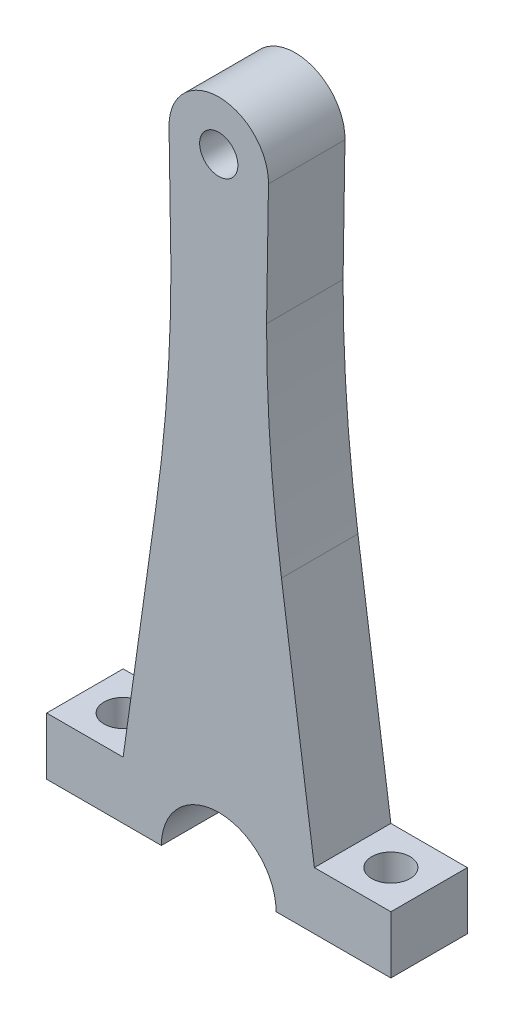
ISO-10303-21;
HEADER;
FILE_DESCRIPTION(('STEP AP214'),'2;1');
FILE_NAME('part.step','',(''),(''),'','','');
FILE_SCHEMA(('AUTOMOTIVE_DESIGN { 1 0 10303 214 1 1 1 1 }'));
ENDSEC;
DATA;
#1=APPLICATION_CONTEXT('core data for automotive mechanical design processes');
#2=APPLICATION_PROTOCOL_DEFINITION('international standard','automotive_design',2000,#1);
#3=PRODUCT_CONTEXT('',#1,'mechanical');
#4=PRODUCT('Part','Part','',(#3));
#5=PRODUCT_RELATED_PRODUCT_CATEGORY('part','',(#4));
#6=PRODUCT_DEFINITION_FORMATION('','',#4);
#7=PRODUCT_DEFINITION_CONTEXT('part definition',#1,'design');
#8=PRODUCT_DEFINITION('design','',#6,#7);
#9=PRODUCT_DEFINITION_SHAPE('','',#8);
#10=(LENGTH_UNIT() NAMED_UNIT(*) SI_UNIT(.MILLI.,.METRE.));
#11=(NAMED_UNIT(*) PLANE_ANGLE_UNIT() SI_UNIT($,.RADIAN.));
#12=(NAMED_UNIT(*) SI_UNIT($,.STERADIAN.) SOLID_ANGLE_UNIT());
#13=UNCERTAINTY_MEASURE_WITH_UNIT(LENGTH_MEASURE(1.E-05),#10,'distance_accuracy_value','');
#14=(GEOMETRIC_REPRESENTATION_CONTEXT(3) GLOBAL_UNCERTAINTY_ASSIGNED_CONTEXT((#13)) GLOBAL_UNIT_ASSIGNED_CONTEXT((#10,
#11,#12)) REPRESENTATION_CONTEXT('',''));
#15=CARTESIAN_POINT('',(0.,0.,0.));
#16=DIRECTION('',(0.,0.,1.));
#17=DIRECTION('',(1.,0.,0.));
#18=AXIS2_PLACEMENT_3D('',#15,#16,#17);
#19=CARTESIAN_POINT('',(10.4353807187644,-0.163126477774048,20.));
#20=DIRECTION('',(-0.999877841767252,0.0156301485233326,0.));
#21=DIRECTION('',(-0.0156301485233326,-0.999877841767252,0.));
#22=AXIS2_PLACEMENT_3D('',#19,#20,#21);
#23=PLANE('',#22);
#24=DIRECTION('',(0.0156301485233326,0.999877841767252,0.));
#25=VECTOR('',#24,1.);
#26=CARTESIAN_POINT('',(10.4353807187644,-0.163126477774048,0.));
#27=LINE('',#26,#25);
#28=CARTESIAN_POINT('',(12.5,131.912846307208,0.));
#29=VERTEX_POINT('',#28);
#30=CARTESIAN_POINT('',(12.9984119429743,163.796808069197,0.));
#31=VERTEX_POINT('',#30);
#32=EDGE_CURVE('E188',#29,#31,#27,.T.);
#33=ORIENTED_EDGE('',*,*,#32,.T.);
#34=DIRECTION('',(0.,0.,-1.));
#35=VECTOR('',#34,1.);
#36=CARTESIAN_POINT('',(12.9984119429743,163.796808069197,20.));
#37=LINE('',#36,#35);
#38=CARTESIAN_POINT('',(12.9984119429743,163.796808069197,20.));
#39=VERTEX_POINT('',#38);
#40=EDGE_CURVE('E11',#39,#31,#37,.T.);
#41=ORIENTED_EDGE('',*,*,#40,.F.);
#42=DIRECTION('',(0.0156301485233326,0.999877841767252,0.));
#43=VECTOR('',#42,1.);
#44=CARTESIAN_POINT('',(10.4353807187644,-0.163126477774048,20.));
#45=LINE('',#44,#43);
#46=CARTESIAN_POINT('',(12.5,131.912846307208,20.));
#47=VERTEX_POINT('',#46);
#48=EDGE_CURVE('E297',#47,#39,#45,.T.);
#49=ORIENTED_EDGE('',*,*,#48,.F.);
#50=DIRECTION('',(0.,0.,-1.));
#51=VECTOR('',#50,1.);
#52=CARTESIAN_POINT('',(12.5,131.912846307208,20.));
#53=LINE('',#52,#51);
#54=EDGE_CURVE('E180',#47,#29,#53,.T.);
#55=ORIENTED_EDGE('',*,*,#54,.T.);
#56=EDGE_LOOP('',(#33,#41,#49,#55));
#57=FACE_BOUND('',#56,.T.);
#58=ADVANCED_FACE('F47',(#57),#23,.F.);
#59=CARTESIAN_POINT('',(0.,164.,20.));
#60=DIRECTION('',(0.,0.,-1.));
#61=DIRECTION('',(-1.,0.,0.));
#62=AXIS2_PLACEMENT_3D('',#59,#60,#61);
#63=CYLINDRICAL_SURFACE('',#62,13.);
#64=CARTESIAN_POINT('',(0.,164.,0.));
#65=DIRECTION('',(0.,0.,1.));
#66=DIRECTION('',(1.,0.,0.));
#67=AXIS2_PLACEMENT_3D('',#64,#65,#66);
#68=CIRCLE('',#67,13.);
#69=CARTESIAN_POINT('',(-12.9984119429743,163.796808069197,0.));
#70=VERTEX_POINT('',#69);
#71=EDGE_CURVE('E193',#31,#70,#68,.T.);
#72=ORIENTED_EDGE('',*,*,#71,.T.);
#73=DIRECTION('',(0.,0.,-1.));
#74=VECTOR('',#73,1.);
#75=CARTESIAN_POINT('',(-12.9984119429743,163.796808069197,20.));
#76=LINE('',#75,#74);
#77=CARTESIAN_POINT('',(-12.9984119429743,163.796808069197,20.));
#78=VERTEX_POINT('',#77);
#79=EDGE_CURVE('E57',#78,#70,#76,.T.);
#80=ORIENTED_EDGE('',*,*,#79,.F.);
#81=CARTESIAN_POINT('',(0.,164.,20.));
#82=DIRECTION('',(0.,0.,1.));
#83=DIRECTION('',(1.,0.,0.));
#84=AXIS2_PLACEMENT_3D('',#81,#82,#83);
#85=CIRCLE('',#84,13.);
#86=EDGE_CURVE('E122',#39,#78,#85,.T.);
#87=ORIENTED_EDGE('',*,*,#86,.F.);
#88=ORIENTED_EDGE('',*,*,#40,.T.);
#89=EDGE_LOOP('',(#72,#80,#87,#88));
#90=FACE_BOUND('',#89,.T.);
#91=ADVANCED_FACE('F277',(#90),#63,.T.);
#92=CARTESIAN_POINT('',(-10.4353807187643,-0.163126477774052,20.));
#93=DIRECTION('',(-0.999877841767252,-0.015630148523333,0.));
#94=DIRECTION('',(0.015630148523333,-0.999877841767252,0.));
#95=AXIS2_PLACEMENT_3D('',#92,#93,#94);
#96=PLANE('',#95);
#97=DIRECTION('',(-0.015630148523333,0.999877841767252,0.));
#98=VECTOR('',#97,1.);
#99=CARTESIAN_POINT('',(-10.4353807187643,-0.163126477774052,0.));
#100=LINE('',#99,#98);
#101=CARTESIAN_POINT('',(-12.5,131.912846307208,0.));
#102=VERTEX_POINT('',#101);
#103=EDGE_CURVE('E197',#102,#70,#100,.T.);
#104=ORIENTED_EDGE('',*,*,#103,.F.);
#105=DIRECTION('',(0.,0.,-1.));
#106=VECTOR('',#105,1.);
#107=CARTESIAN_POINT('',(-12.5,131.912846307208,20.));
#108=LINE('',#107,#106);
#109=CARTESIAN_POINT('',(-12.5,131.912846307208,20.));
#110=VERTEX_POINT('',#109);
#111=EDGE_CURVE('E268',#110,#102,#108,.T.);
#112=ORIENTED_EDGE('',*,*,#111,.F.);
#113=DIRECTION('',(-0.015630148523333,0.999877841767252,0.));
#114=VECTOR('',#113,1.);
#115=CARTESIAN_POINT('',(-10.4353807187643,-0.163126477774052,20.));
#116=LINE('',#115,#114);
#117=EDGE_CURVE('E276',#110,#78,#116,.T.);
#118=ORIENTED_EDGE('',*,*,#117,.T.);
#119=ORIENTED_EDGE('',*,*,#79,.T.);
#120=EDGE_LOOP('',(#104,#112,#118,#119));
#121=FACE_BOUND('',#120,.T.);
#122=ADVANCED_FACE('F274',(#121),#96,.T.);
#123=CARTESIAN_POINT('',(-412.5,131.912846307206,20.));
#124=DIRECTION('',(0.,0.,-1.));
#125=DIRECTION('',(-1.,0.,0.));
#126=AXIS2_PLACEMENT_3D('',#123,#124,#125);
#127=CYLINDRICAL_SURFACE('',#126,400.);
#128=CARTESIAN_POINT('',(-412.5,131.912846307206,0.));
#129=DIRECTION('',(0.,0.,1.));
#130=DIRECTION('',(1.,0.,0.));
#131=AXIS2_PLACEMENT_3D('',#128,#129,#130);
#132=CIRCLE('',#131,400.);
#133=CARTESIAN_POINT('',(-16.3927725033721,76.2436059231789,0.));
#134=VERTEX_POINT('',#133);
#135=EDGE_CURVE('E201',#134,#102,#132,.T.);
#136=ORIENTED_EDGE('',*,*,#135,.F.);
#137=DIRECTION('',(0.,0.,-1.));
#138=VECTOR('',#137,1.);
#139=CARTESIAN_POINT('',(-16.3927725033721,76.2436059231789,20.));
#140=LINE('',#139,#138);
#141=CARTESIAN_POINT('',(-16.3927725033721,76.2436059231789,20.));
#142=VERTEX_POINT('',#141);
#143=EDGE_CURVE('E265',#142,#134,#140,.T.);
#144=ORIENTED_EDGE('',*,*,#143,.F.);
#145=CARTESIAN_POINT('',(-412.5,131.912846307206,20.));
#146=DIRECTION('',(0.,0.,1.));
#147=DIRECTION('',(1.,0.,0.));
#148=AXIS2_PLACEMENT_3D('',#145,#146,#147);
#149=CIRCLE('',#148,400.);
#150=EDGE_CURVE('E288',#142,#110,#149,.T.);
#151=ORIENTED_EDGE('',*,*,#150,.T.);
#152=ORIENTED_EDGE('',*,*,#111,.T.);
#153=EDGE_LOOP('',(#136,#144,#151,#152));
#154=FACE_BOUND('',#153,.T.);
#155=ADVANCED_FACE('F285',(#154),#127,.F.);
#156=CARTESIAN_POINT('',(-26.5830513678565,3.73600422817511,20.));
#157=DIRECTION('',(-0.99026806874157,0.139173100960066,0.));
#158=DIRECTION('',(-0.139173100960066,-0.99026806874157,0.));
#159=AXIS2_PLACEMENT_3D('',#156,#157,#158);
#160=PLANE('',#159);
#161=DIRECTION('',(0.139173100960066,0.99026806874157,0.));
#162=VECTOR('',#161,1.);
#163=CARTESIAN_POINT('',(-26.5830513678565,3.73600422817511,0.));
#164=LINE('',#163,#162);
#165=CARTESIAN_POINT('',(-25.,15.,0.));
#166=VERTEX_POINT('',#165);
#167=EDGE_CURVE('E205',#166,#134,#164,.T.);
#168=ORIENTED_EDGE('',*,*,#167,.F.);
#169=DIRECTION('',(0.,0.,-1.));
#170=VECTOR('',#169,1.);
#171=CARTESIAN_POINT('',(-25.,15.,20.));
#172=LINE('',#171,#170);
#173=CARTESIAN_POINT('',(-25.,15.,20.));
#174=VERTEX_POINT('',#173);
#175=EDGE_CURVE('E262',#174,#166,#172,.T.);
#176=ORIENTED_EDGE('',*,*,#175,.F.);
#177=DIRECTION('',(0.139173100960066,0.99026806874157,0.));
#178=VECTOR('',#177,1.);
#179=CARTESIAN_POINT('',(-26.5830513678565,3.73600422817511,20.));
#180=LINE('',#179,#178);
#181=EDGE_CURVE('E295',#174,#142,#180,.T.);
#182=ORIENTED_EDGE('',*,*,#181,.T.);
#183=ORIENTED_EDGE('',*,*,#143,.T.);
#184=EDGE_LOOP('',(#168,#176,#182,#183));
#185=FACE_BOUND('',#184,.T.);
#186=ADVANCED_FACE('F351',(#185),#160,.T.);
#187=CARTESIAN_POINT('',(0.,15.,20.));
#188=DIRECTION('',(0.,1.,0.));
#189=DIRECTION('',(0.,0.,1.));
#190=AXIS2_PLACEMENT_3D('',#187,#188,#189);
#191=PLANE('',#190);
#192=CARTESIAN_POINT('',(-35.,15.,10.));
#193=DIRECTION('',(0.,1.,0.));
#194=DIRECTION('',(0.,0.,1.));
#195=AXIS2_PLACEMENT_3D('',#192,#193,#194);
#196=CIRCLE('',#195,5.);
#197=CARTESIAN_POINT('',(-35.,15.,15.));
#198=VERTEX_POINT('',#197);
#199=EDGE_CURVE('E438',#198,#198,#196,.T.);
#200=ORIENTED_EDGE('',*,*,#199,.F.);
#201=EDGE_LOOP('',(#200));
#202=FACE_BOUND('',#201,.T.);
#203=DIRECTION('',(1.,0.,0.));
#204=VECTOR('',#203,1.);
#205=CARTESIAN_POINT('',(0.,15.,0.));
#206=LINE('',#205,#204);
#207=CARTESIAN_POINT('',(-45.,15.,0.));
#208=VERTEX_POINT('',#207);
#209=EDGE_CURVE('E209',#208,#166,#206,.T.);
#210=ORIENTED_EDGE('',*,*,#209,.F.);
#211=DIRECTION('',(0.,0.,-1.));
#212=VECTOR('',#211,1.);
#213=CARTESIAN_POINT('',(-45.,15.,20.));
#214=LINE('',#213,#212);
#215=CARTESIAN_POINT('',(-45.,15.,20.));
#216=VERTEX_POINT('',#215);
#217=EDGE_CURVE('E259',#216,#208,#214,.T.);
#218=ORIENTED_EDGE('',*,*,#217,.F.);
#219=DIRECTION('',(1.,0.,0.));
#220=VECTOR('',#219,1.);
#221=CARTESIAN_POINT('',(0.,15.,20.));
#222=LINE('',#221,#220);
#223=EDGE_CURVE('E303',#216,#174,#222,.T.);
#224=ORIENTED_EDGE('',*,*,#223,.T.);
#225=ORIENTED_EDGE('',*,*,#175,.T.);
#226=EDGE_LOOP('',(#210,#218,#224,#225));
#227=FACE_BOUND('',#226,.T.);
#228=ADVANCED_FACE('F354',(#202,#227),#191,.T.);
#229=CARTESIAN_POINT('',(-45.,0.,20.));
#230=DIRECTION('',(-1.,0.,0.));
#231=DIRECTION('',(0.,0.,1.));
#232=AXIS2_PLACEMENT_3D('',#229,#230,#231);
#233=PLANE('',#232);
#234=DIRECTION('',(0.,1.,0.));
#235=VECTOR('',#234,1.);
#236=CARTESIAN_POINT('',(-45.,0.,0.));
#237=LINE('',#236,#235);
#238=CARTESIAN_POINT('',(-45.,0.,0.));
#239=VERTEX_POINT('',#238);
#240=EDGE_CURVE('E213',#239,#208,#237,.T.);
#241=ORIENTED_EDGE('',*,*,#240,.F.);
#242=DIRECTION('',(0.,0.,-1.));
#243=VECTOR('',#242,1.);
#244=CARTESIAN_POINT('',(-45.,0.,20.));
#245=LINE('',#244,#243);
#246=CARTESIAN_POINT('',(-45.,0.,20.));
#247=VERTEX_POINT('',#246);
#248=EDGE_CURVE('E256',#247,#239,#245,.T.);
#249=ORIENTED_EDGE('',*,*,#248,.F.);
#250=DIRECTION('',(0.,1.,0.));
#251=VECTOR('',#250,1.);
#252=CARTESIAN_POINT('',(-45.,0.,20.));
#253=LINE('',#252,#251);
#254=EDGE_CURVE('E307',#247,#216,#253,.T.);
#255=ORIENTED_EDGE('',*,*,#254,.T.);
#256=ORIENTED_EDGE('',*,*,#217,.T.);
#257=EDGE_LOOP('',(#241,#249,#255,#256));
#258=FACE_BOUND('',#257,.T.);
#259=ADVANCED_FACE('F358',(#258),#233,.T.);
#260=CARTESIAN_POINT('',(0.,0.,20.));
#261=DIRECTION('',(0.,-1.,0.));
#262=DIRECTION('',(1.,0.,0.));
#263=AXIS2_PLACEMENT_3D('',#260,#261,#262);
#264=PLANE('',#263);
#265=CARTESIAN_POINT('',(-35.,0.,10.));
#266=DIRECTION('',(0.,1.,0.));
#267=DIRECTION('',(0.,0.,1.));
#268=AXIS2_PLACEMENT_3D('',#265,#266,#267);
#269=CIRCLE('',#268,5.);
#270=CARTESIAN_POINT('',(-35.,0.,15.));
#271=VERTEX_POINT('',#270);
#272=EDGE_CURVE('E435',#271,#271,#269,.T.);
#273=ORIENTED_EDGE('',*,*,#272,.T.);
#274=EDGE_LOOP('',(#273));
#275=FACE_BOUND('',#274,.T.);
#276=DIRECTION('',(-1.,0.,0.));
#277=VECTOR('',#276,1.);
#278=CARTESIAN_POINT('',(0.,0.,0.));
#279=LINE('',#278,#277);
#280=CARTESIAN_POINT('',(-15.,0.,0.));
#281=VERTEX_POINT('',#280);
#282=EDGE_CURVE('E217',#281,#239,#279,.T.);
#283=ORIENTED_EDGE('',*,*,#282,.F.);
#284=DIRECTION('',(0.,0.,-1.));
#285=VECTOR('',#284,1.);
#286=CARTESIAN_POINT('',(-15.,0.,20.));
#287=LINE('',#286,#285);
#288=CARTESIAN_POINT('',(-15.,0.,20.));
#289=VERTEX_POINT('',#288);
#290=EDGE_CURVE('E253',#289,#281,#287,.T.);
#291=ORIENTED_EDGE('',*,*,#290,.F.);
#292=DIRECTION('',(-1.,0.,0.));
#293=VECTOR('',#292,1.);
#294=CARTESIAN_POINT('',(0.,0.,20.));
#295=LINE('',#294,#293);
#296=EDGE_CURVE('E311',#289,#247,#295,.T.);
#297=ORIENTED_EDGE('',*,*,#296,.T.);
#298=ORIENTED_EDGE('',*,*,#248,.T.);
#299=EDGE_LOOP('',(#283,#291,#297,#298));
#300=FACE_BOUND('',#299,.T.);
#301=ADVANCED_FACE('F362',(#275,#300),#264,.T.);
#302=CARTESIAN_POINT('',(0.,0.,20.));
#303=DIRECTION('',(0.,0.,-1.));
#304=DIRECTION('',(-1.,0.,0.));
#305=AXIS2_PLACEMENT_3D('',#302,#303,#304);
#306=CYLINDRICAL_SURFACE('',#305,15.);
#307=CARTESIAN_POINT('',(0.,0.,0.));
#308=DIRECTION('',(0.,0.,1.));
#309=DIRECTION('',(1.,0.,0.));
#310=AXIS2_PLACEMENT_3D('',#307,#308,#309);
#311=CIRCLE('',#310,15.);
#312=CARTESIAN_POINT('',(15.,0.,0.));
#313=VERTEX_POINT('',#312);
#314=EDGE_CURVE('E221',#313,#281,#311,.T.);
#315=ORIENTED_EDGE('',*,*,#314,.F.);
#316=DIRECTION('',(0.,0.,-1.));
#317=VECTOR('',#316,1.);
#318=CARTESIAN_POINT('',(15.,0.,20.));
#319=LINE('',#318,#317);
#320=CARTESIAN_POINT('',(15.,0.,20.));
#321=VERTEX_POINT('',#320);
#322=EDGE_CURVE('E250',#321,#313,#319,.T.);
#323=ORIENTED_EDGE('',*,*,#322,.F.);
#324=CARTESIAN_POINT('',(0.,0.,20.));
#325=DIRECTION('',(0.,0.,1.));
#326=DIRECTION('',(1.,0.,0.));
#327=AXIS2_PLACEMENT_3D('',#324,#325,#326);
#328=CIRCLE('',#327,15.);
#329=EDGE_CURVE('E315',#321,#289,#328,.T.);
#330=ORIENTED_EDGE('',*,*,#329,.T.);
#331=ORIENTED_EDGE('',*,*,#290,.T.);
#332=EDGE_LOOP('',(#315,#323,#330,#331));
#333=FACE_BOUND('',#332,.T.);
#334=ADVANCED_FACE('F366',(#333),#306,.F.);
#335=CARTESIAN_POINT('',(0.,0.,20.));
#336=DIRECTION('',(0.,-1.,0.));
#337=DIRECTION('',(1.,0.,0.));
#338=AXIS2_PLACEMENT_3D('',#335,#336,#337);
#339=PLANE('',#338);
#340=CARTESIAN_POINT('',(35.,0.,10.));
#341=DIRECTION('',(0.,1.,0.));
#342=DIRECTION('',(0.,0.,1.));
#343=AXIS2_PLACEMENT_3D('',#340,#341,#342);
#344=CIRCLE('',#343,5.);
#345=CARTESIAN_POINT('',(35.,0.,15.));
#346=VERTEX_POINT('',#345);
#347=EDGE_CURVE('E189',#346,#346,#344,.T.);
#348=ORIENTED_EDGE('',*,*,#347,.T.);
#349=EDGE_LOOP('',(#348));
#350=FACE_BOUND('',#349,.T.);
#351=DIRECTION('',(-1.,0.,0.));
#352=VECTOR('',#351,1.);
#353=CARTESIAN_POINT('',(0.,0.,0.));
#354=LINE('',#353,#352);
#355=CARTESIAN_POINT('',(45.,0.,0.));
#356=VERTEX_POINT('',#355);
#357=EDGE_CURVE('E225',#356,#313,#354,.T.);
#358=ORIENTED_EDGE('',*,*,#357,.F.);
#359=DIRECTION('',(0.,0.,-1.));
#360=VECTOR('',#359,1.);
#361=CARTESIAN_POINT('',(45.,0.,20.));
#362=LINE('',#361,#360);
#363=CARTESIAN_POINT('',(45.,0.,20.));
#364=VERTEX_POINT('',#363);
#365=EDGE_CURVE('E247',#364,#356,#362,.T.);
#366=ORIENTED_EDGE('',*,*,#365,.F.);
#367=DIRECTION('',(-1.,0.,0.));
#368=VECTOR('',#367,1.);
#369=CARTESIAN_POINT('',(0.,0.,20.));
#370=LINE('',#369,#368);
#371=EDGE_CURVE('E319',#364,#321,#370,.T.);
#372=ORIENTED_EDGE('',*,*,#371,.T.);
#373=ORIENTED_EDGE('',*,*,#322,.T.);
#374=EDGE_LOOP('',(#358,#366,#372,#373));
#375=FACE_BOUND('',#374,.T.);
#376=ADVANCED_FACE('F370',(#350,#375),#339,.T.);
#377=CARTESIAN_POINT('',(45.,0.,20.));
#378=DIRECTION('',(1.,0.,0.));
#379=DIRECTION('',(0.,0.,-1.));
#380=AXIS2_PLACEMENT_3D('',#377,#378,#379);
#381=PLANE('',#380);
#382=DIRECTION('',(0.,-1.,0.));
#383=VECTOR('',#382,1.);
#384=CARTESIAN_POINT('',(45.,0.,0.));
#385=LINE('',#384,#383);
#386=CARTESIAN_POINT('',(45.,15.,0.));
#387=VERTEX_POINT('',#386);
#388=EDGE_CURVE('E229',#387,#356,#385,.T.);
#389=ORIENTED_EDGE('',*,*,#388,.F.);
#390=DIRECTION('',(0.,0.,-1.));
#391=VECTOR('',#390,1.);
#392=CARTESIAN_POINT('',(45.,15.,20.));
#393=LINE('',#392,#391);
#394=CARTESIAN_POINT('',(45.,15.,20.));
#395=VERTEX_POINT('',#394);
#396=EDGE_CURVE('E166',#395,#387,#393,.T.);
#397=ORIENTED_EDGE('',*,*,#396,.F.);
#398=DIRECTION('',(0.,-1.,0.));
#399=VECTOR('',#398,1.);
#400=CARTESIAN_POINT('',(45.,0.,20.));
#401=LINE('',#400,#399);
#402=EDGE_CURVE('E173',#395,#364,#401,.T.);
#403=ORIENTED_EDGE('',*,*,#402,.T.);
#404=ORIENTED_EDGE('',*,*,#365,.T.);
#405=EDGE_LOOP('',(#389,#397,#403,#404));
#406=FACE_BOUND('',#405,.T.);
#407=ADVANCED_FACE('F325',(#406),#381,.T.);
#408=CARTESIAN_POINT('',(0.,15.,20.));
#409=DIRECTION('',(0.,1.,0.));
#410=DIRECTION('',(0.,0.,1.));
#411=AXIS2_PLACEMENT_3D('',#408,#409,#410);
#412=PLANE('',#411);
#413=CARTESIAN_POINT('',(35.,15.,10.));
#414=DIRECTION('',(0.,1.,0.));
#415=DIRECTION('',(0.,0.,1.));
#416=AXIS2_PLACEMENT_3D('',#413,#414,#415);
#417=CIRCLE('',#416,5.);
#418=CARTESIAN_POINT('',(35.,15.,15.));
#419=VERTEX_POINT('',#418);
#420=EDGE_CURVE('E442',#419,#419,#417,.T.);
#421=ORIENTED_EDGE('',*,*,#420,.F.);
#422=EDGE_LOOP('',(#421));
#423=FACE_BOUND('',#422,.T.);
#424=DIRECTION('',(1.,0.,0.));
#425=VECTOR('',#424,1.);
#426=CARTESIAN_POINT('',(0.,15.,0.));
#427=LINE('',#426,#425);
#428=CARTESIAN_POINT('',(25.,15.,0.));
#429=VERTEX_POINT('',#428);
#430=EDGE_CURVE('E160',#429,#387,#427,.T.);
#431=ORIENTED_EDGE('',*,*,#430,.F.);
#432=DIRECTION('',(0.,0.,-1.));
#433=VECTOR('',#432,1.);
#434=CARTESIAN_POINT('',(25.,15.,20.));
#435=LINE('',#434,#433);
#436=CARTESIAN_POINT('',(25.,15.,20.));
#437=VERTEX_POINT('',#436);
#438=EDGE_CURVE('E155',#437,#429,#435,.T.);
#439=ORIENTED_EDGE('',*,*,#438,.F.);
#440=DIRECTION('',(1.,0.,0.));
#441=VECTOR('',#440,1.);
#442=CARTESIAN_POINT('',(0.,15.,20.));
#443=LINE('',#442,#441);
#444=EDGE_CURVE('E158',#437,#395,#443,.T.);
#445=ORIENTED_EDGE('',*,*,#444,.T.);
#446=ORIENTED_EDGE('',*,*,#396,.T.);
#447=EDGE_LOOP('',(#431,#439,#445,#446));
#448=FACE_BOUND('',#447,.T.);
#449=ADVANCED_FACE('F157',(#423,#448),#412,.T.);
#450=CARTESIAN_POINT('',(26.5830513678565,3.7360042281751,20.));
#451=DIRECTION('',(0.99026806874157,0.139173100960066,0.));
#452=DIRECTION('',(-0.139173100960066,0.99026806874157,0.));
#453=AXIS2_PLACEMENT_3D('',#450,#451,#452);
#454=PLANE('',#453);
#455=DIRECTION('',(0.139173100960066,-0.99026806874157,0.));
#456=VECTOR('',#455,1.);
#457=CARTESIAN_POINT('',(26.5830513678565,3.7360042281751,0.));
#458=LINE('',#457,#456);
#459=CARTESIAN_POINT('',(16.3927725033721,76.243605923179,0.));
#460=VERTEX_POINT('',#459);
#461=EDGE_CURVE('E235',#460,#429,#458,.T.);
#462=ORIENTED_EDGE('',*,*,#461,.F.);
#463=DIRECTION('',(0.,0.,-1.));
#464=VECTOR('',#463,1.);
#465=CARTESIAN_POINT('',(16.3927725033721,76.243605923179,20.));
#466=LINE('',#465,#464);
#467=CARTESIAN_POINT('',(16.3927725033721,76.243605923179,20.));
#468=VERTEX_POINT('',#467);
#469=EDGE_CURVE('E111',#468,#460,#466,.T.);
#470=ORIENTED_EDGE('',*,*,#469,.F.);
#471=DIRECTION('',(0.139173100960066,-0.99026806874157,0.));
#472=VECTOR('',#471,1.);
#473=CARTESIAN_POINT('',(26.5830513678565,3.7360042281751,20.));
#474=LINE('',#473,#472);
#475=EDGE_CURVE('E170',#468,#437,#474,.T.);
#476=ORIENTED_EDGE('',*,*,#475,.T.);
#477=ORIENTED_EDGE('',*,*,#438,.T.);
#478=EDGE_LOOP('',(#462,#470,#476,#477));
#479=FACE_BOUND('',#478,.T.);
#480=ADVANCED_FACE('F176',(#479),#454,.T.);
#481=CARTESIAN_POINT('',(0.,164.,20.));
#482=DIRECTION('',(0.,0.,-1.));
#483=DIRECTION('',(-1.,0.,0.));
#484=AXIS2_PLACEMENT_3D('',#481,#482,#483);
#485=CYLINDRICAL_SURFACE('',#484,5.);
#486=CARTESIAN_POINT('',(0.,164.,20.));
#487=DIRECTION('',(0.,0.,1.));
#488=DIRECTION('',(1.,0.,0.));
#489=AXIS2_PLACEMENT_3D('',#486,#487,#488);
#490=CIRCLE('',#489,5.);
#491=CARTESIAN_POINT('',(5.,164.,20.));
#492=VERTEX_POINT('',#491);
#493=EDGE_CURVE('E240',#492,#492,#490,.T.);
#494=ORIENTED_EDGE('',*,*,#493,.T.);
#495=EDGE_LOOP('',(#494));
#496=FACE_BOUND('',#495,.T.);
#497=CARTESIAN_POINT('',(0.,164.,0.));
#498=DIRECTION('',(0.,0.,1.));
#499=DIRECTION('',(1.,0.,0.));
#500=AXIS2_PLACEMENT_3D('',#497,#498,#499);
#501=CIRCLE('',#500,5.);
#502=CARTESIAN_POINT('',(5.,164.,0.));
#503=VERTEX_POINT('',#502);
#504=EDGE_CURVE('E184',#503,#503,#501,.T.);
#505=ORIENTED_EDGE('',*,*,#504,.F.);
#506=EDGE_LOOP('',(#505));
#507=FACE_BOUND('',#506,.T.);
#508=ADVANCED_FACE('F49',(#496,#507),#485,.F.);
#509=CARTESIAN_POINT('',(412.5,131.912846307206,20.));
#510=DIRECTION('',(0.,0.,-1.));
#511=DIRECTION('',(-1.,0.,0.));
#512=AXIS2_PLACEMENT_3D('',#509,#510,#511);
#513=CYLINDRICAL_SURFACE('',#512,400.);
#514=CARTESIAN_POINT('',(412.5,131.912846307206,0.));
#515=DIRECTION('',(0.,0.,1.));
#516=DIRECTION('',(1.,0.,0.));
#517=AXIS2_PLACEMENT_3D('',#514,#515,#516);
#518=CIRCLE('',#517,400.);
#519=EDGE_CURVE('E114',#460,#29,#518,.F.);
#520=ORIENTED_EDGE('',*,*,#519,.T.);
#521=ORIENTED_EDGE('',*,*,#54,.F.);
#522=CARTESIAN_POINT('',(412.5,131.912846307206,20.));
#523=DIRECTION('',(0.,0.,1.));
#524=DIRECTION('',(1.,0.,0.));
#525=AXIS2_PLACEMENT_3D('',#522,#523,#524);
#526=CIRCLE('',#525,400.);
#527=EDGE_CURVE('E65',#468,#47,#526,.F.);
#528=ORIENTED_EDGE('',*,*,#527,.F.);
#529=ORIENTED_EDGE('',*,*,#469,.T.);
#530=EDGE_LOOP('',(#520,#521,#528,#529));
#531=FACE_BOUND('',#530,.T.);
#532=ADVANCED_FACE('F329',(#531),#513,.F.);
#533=CARTESIAN_POINT('',(0.,0.,20.));
#534=DIRECTION('',(0.,0.,1.));
#535=DIRECTION('',(1.,0.,0.));
#536=AXIS2_PLACEMENT_3D('',#533,#534,#535);
#537=PLANE('',#536);
#538=ORIENTED_EDGE('',*,*,#493,.F.);
#539=EDGE_LOOP('',(#538));
#540=FACE_BOUND('',#539,.T.);
#541=ORIENTED_EDGE('',*,*,#48,.T.);
#542=ORIENTED_EDGE('',*,*,#86,.T.);
#543=ORIENTED_EDGE('',*,*,#117,.F.);
#544=ORIENTED_EDGE('',*,*,#150,.F.);
#545=ORIENTED_EDGE('',*,*,#181,.F.);
#546=ORIENTED_EDGE('',*,*,#223,.F.);
#547=ORIENTED_EDGE('',*,*,#254,.F.);
#548=ORIENTED_EDGE('',*,*,#296,.F.);
#549=ORIENTED_EDGE('',*,*,#329,.F.);
#550=ORIENTED_EDGE('',*,*,#371,.F.);
#551=ORIENTED_EDGE('',*,*,#402,.F.);
#552=ORIENTED_EDGE('',*,*,#444,.F.);
#553=ORIENTED_EDGE('',*,*,#475,.F.);
#554=ORIENTED_EDGE('',*,*,#527,.T.);
#555=EDGE_LOOP('',(#541,#542,#543,#544,#545,#546,#547,#548,#549,#550,#551,#552,#553,#554));
#556=FACE_BOUND('',#555,.T.);
#557=ADVANCED_FACE('F169',(#540,#556),#537,.T.);
#558=CARTESIAN_POINT('',(0.,0.,0.));
#559=DIRECTION('',(0.,0.,1.));
#560=DIRECTION('',(1.,0.,0.));
#561=AXIS2_PLACEMENT_3D('',#558,#559,#560);
#562=PLANE('',#561);
#563=ORIENTED_EDGE('',*,*,#504,.T.);
#564=EDGE_LOOP('',(#563));
#565=FACE_BOUND('',#564,.T.);
#566=ORIENTED_EDGE('',*,*,#32,.F.);
#567=ORIENTED_EDGE('',*,*,#519,.F.);
#568=ORIENTED_EDGE('',*,*,#461,.T.);
#569=ORIENTED_EDGE('',*,*,#430,.T.);
#570=ORIENTED_EDGE('',*,*,#388,.T.);
#571=ORIENTED_EDGE('',*,*,#357,.T.);
#572=ORIENTED_EDGE('',*,*,#314,.T.);
#573=ORIENTED_EDGE('',*,*,#282,.T.);
#574=ORIENTED_EDGE('',*,*,#240,.T.);
#575=ORIENTED_EDGE('',*,*,#209,.T.);
#576=ORIENTED_EDGE('',*,*,#167,.T.);
#577=ORIENTED_EDGE('',*,*,#135,.T.);
#578=ORIENTED_EDGE('',*,*,#103,.T.);
#579=ORIENTED_EDGE('',*,*,#71,.F.);
#580=EDGE_LOOP('',(#566,#567,#568,#569,#570,#571,#572,#573,#574,#575,#576,#577,#578,#579));
#581=FACE_BOUND('',#580,.T.);
#582=ADVANCED_FACE('F281',(#565,#581),#562,.F.);
#583=CARTESIAN_POINT('',(35.,15.,10.));
#584=DIRECTION('',(0.,1.,0.));
#585=DIRECTION('',(0.,0.,1.));
#586=AXIS2_PLACEMENT_3D('',#583,#584,#585);
#587=CYLINDRICAL_SURFACE('',#586,5.);
#588=ORIENTED_EDGE('',*,*,#347,.F.);
#589=EDGE_LOOP('',(#588));
#590=FACE_BOUND('',#589,.T.);
#591=ORIENTED_EDGE('',*,*,#420,.T.);
#592=EDGE_LOOP('',(#591));
#593=FACE_BOUND('',#592,.T.);
#594=ADVANCED_FACE('F410',(#590,#593),#587,.F.);
#595=CARTESIAN_POINT('',(-35.,15.,10.));
#596=DIRECTION('',(0.,1.,0.));
#597=DIRECTION('',(0.,0.,1.));
#598=AXIS2_PLACEMENT_3D('',#595,#596,#597);
#599=CYLINDRICAL_SURFACE('',#598,5.);
#600=ORIENTED_EDGE('',*,*,#272,.F.);
#601=EDGE_LOOP('',(#600));
#602=FACE_BOUND('',#601,.T.);
#603=ORIENTED_EDGE('',*,*,#199,.T.);
#604=EDGE_LOOP('',(#603));
#605=FACE_BOUND('',#604,.T.);
#606=ADVANCED_FACE('F419',(#602,#605),#599,.F.);
#607=CLOSED_SHELL('',(#58,#91,#122,#155,#186,#228,#259,#301,#334,#376,#407,#449,#480,#508,#532,
#557,#582,#594,#606));
#608=MANIFOLD_SOLID_BREP('B2',#607);
#609=ADVANCED_BREP_SHAPE_REPRESENTATION('',(#18,#608),#14);
#610=SHAPE_DEFINITION_REPRESENTATION(#9,#609);
ENDSEC;
END-ISO-10303-21;
